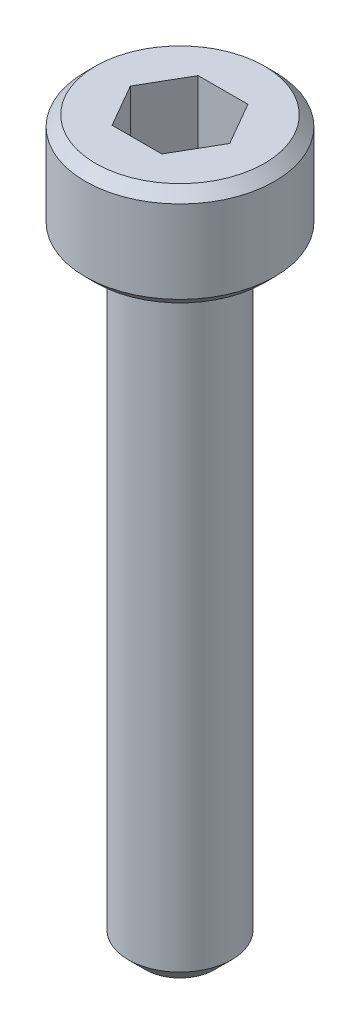
ISO-10303-21;
HEADER;
FILE_DESCRIPTION(('STEP AP214'),'2;1');
FILE_NAME('part.step','',(''),(''),'','','');
FILE_SCHEMA(('AUTOMOTIVE_DESIGN { 1 0 10303 214 1 1 1 1 }'));
ENDSEC;
DATA;
#1=APPLICATION_CONTEXT('core data for automotive mechanical design processes');
#2=APPLICATION_PROTOCOL_DEFINITION('international standard','automotive_design',2000,#1);
#3=PRODUCT_CONTEXT('',#1,'mechanical');
#4=PRODUCT('Part','Part','',(#3));
#5=PRODUCT_RELATED_PRODUCT_CATEGORY('part','',(#4));
#6=PRODUCT_DEFINITION_FORMATION('','',#4);
#7=PRODUCT_DEFINITION_CONTEXT('part definition',#1,'design');
#8=PRODUCT_DEFINITION('design','',#6,#7);
#9=PRODUCT_DEFINITION_SHAPE('','',#8);
#10=(LENGTH_UNIT() NAMED_UNIT(*) SI_UNIT(.MILLI.,.METRE.));
#11=(NAMED_UNIT(*) PLANE_ANGLE_UNIT() SI_UNIT($,.RADIAN.));
#12=(NAMED_UNIT(*) SI_UNIT($,.STERADIAN.) SOLID_ANGLE_UNIT());
#13=UNCERTAINTY_MEASURE_WITH_UNIT(LENGTH_MEASURE(1.E-05),#10,'distance_accuracy_value','');
#14=(GEOMETRIC_REPRESENTATION_CONTEXT(3) GLOBAL_UNCERTAINTY_ASSIGNED_CONTEXT((#13)) GLOBAL_UNIT_ASSIGNED_CONTEXT((#10,
#11,#12)) REPRESENTATION_CONTEXT('',''));
#15=CARTESIAN_POINT('',(0.,0.,0.));
#16=DIRECTION('',(0.,0.,1.));
#17=DIRECTION('',(1.,0.,0.));
#18=AXIS2_PLACEMENT_3D('',#15,#16,#17);
#19=CARTESIAN_POINT('',(-1.44337567297406,0.5,0.));
#20=DIRECTION('',(-0.866025403784439,0.,0.5));
#21=DIRECTION('',(0.5,0.,0.866025403784439));
#22=AXIS2_PLACEMENT_3D('',#19,#20,#21);
#23=PLANE('',#22);
#24=DIRECTION('',(0.,1.,0.));
#25=VECTOR('',#24,1.);
#26=CARTESIAN_POINT('',(-0.721687836487032,0.5,1.25));
#27=LINE('',#26,#25);
#28=CARTESIAN_POINT('',(-0.721687836487032,3.,1.25));
#29=VERTEX_POINT('',#28);
#30=CARTESIAN_POINT('',(-0.721687836487032,0.5,1.25));
#31=VERTEX_POINT('',#30);
#32=EDGE_CURVE('E82',#29,#31,#27,.F.);
#33=ORIENTED_EDGE('',*,*,#32,.T.);
#34=DIRECTION('',(0.5,0.,0.866025403784439));
#35=VECTOR('',#34,1.);
#36=CARTESIAN_POINT('',(-1.44337567297406,0.5,0.));
#37=LINE('',#36,#35);
#38=CARTESIAN_POINT('',(-1.44337567297406,0.5,0.));
#39=VERTEX_POINT('',#38);
#40=EDGE_CURVE('E71',#39,#31,#37,.T.);
#41=ORIENTED_EDGE('',*,*,#40,.F.);
#42=DIRECTION('',(0.,1.,0.));
#43=VECTOR('',#42,1.);
#44=CARTESIAN_POINT('',(-1.44337567297406,0.5,0.));
#45=LINE('',#44,#43);
#46=CARTESIAN_POINT('',(-1.44337567297406,3.,0.));
#47=VERTEX_POINT('',#46);
#48=EDGE_CURVE('E90',#39,#47,#45,.T.);
#49=ORIENTED_EDGE('',*,*,#48,.T.);
#50=DIRECTION('',(0.5,0.,0.866025403784439));
#51=VECTOR('',#50,1.);
#52=CARTESIAN_POINT('',(-1.44337567297406,3.,0.));
#53=LINE('',#52,#51);
#54=EDGE_CURVE('E66',#29,#47,#53,.F.);
#55=ORIENTED_EDGE('',*,*,#54,.F.);
#56=EDGE_LOOP('',(#33,#41,#49,#55));
#57=FACE_BOUND('',#56,.T.);
#58=ADVANCED_FACE('F16',(#57),#23,.F.);
#59=CARTESIAN_POINT('',(-0.721687836487032,0.5,1.25));
#60=DIRECTION('',(0.,0.,1.));
#61=DIRECTION('',(1.,0.,0.));
#62=AXIS2_PLACEMENT_3D('',#59,#60,#61);
#63=PLANE('',#62);
#64=DIRECTION('',(0.,1.,0.));
#65=VECTOR('',#64,1.);
#66=CARTESIAN_POINT('',(0.721687836487032,0.5,1.25));
#67=LINE('',#66,#65);
#68=CARTESIAN_POINT('',(0.721687836487032,3.,1.25));
#69=VERTEX_POINT('',#68);
#70=CARTESIAN_POINT('',(0.721687836487032,0.5,1.25));
#71=VERTEX_POINT('',#70);
#72=EDGE_CURVE('E86',#69,#71,#67,.F.);
#73=ORIENTED_EDGE('',*,*,#72,.T.);
#74=DIRECTION('',(1.,0.,0.));
#75=VECTOR('',#74,1.);
#76=CARTESIAN_POINT('',(-0.721687836487032,0.5,1.25));
#77=LINE('',#76,#75);
#78=EDGE_CURVE('E75',#31,#71,#77,.T.);
#79=ORIENTED_EDGE('',*,*,#78,.F.);
#80=ORIENTED_EDGE('',*,*,#32,.F.);
#81=DIRECTION('',(1.,0.,0.));
#82=VECTOR('',#81,1.);
#83=CARTESIAN_POINT('',(-0.721687836487032,3.,1.25));
#84=LINE('',#83,#82);
#85=EDGE_CURVE('E88',#69,#29,#84,.F.);
#86=ORIENTED_EDGE('',*,*,#85,.F.);
#87=EDGE_LOOP('',(#73,#79,#80,#86));
#88=FACE_BOUND('',#87,.T.);
#89=ADVANCED_FACE('F85',(#88),#63,.F.);
#90=CARTESIAN_POINT('',(-0.721687836487032,0.5,-1.25));
#91=DIRECTION('',(-0.866025403784439,0.,-0.5));
#92=DIRECTION('',(-0.5,0.,0.866025403784439));
#93=AXIS2_PLACEMENT_3D('',#90,#91,#92);
#94=PLANE('',#93);
#95=ORIENTED_EDGE('',*,*,#48,.F.);
#96=DIRECTION('',(-0.5,0.,0.866025403784439));
#97=VECTOR('',#96,1.);
#98=CARTESIAN_POINT('',(-0.721687836487032,0.5,-1.25));
#99=LINE('',#98,#97);
#100=CARTESIAN_POINT('',(-0.721687836487032,0.5,-1.25));
#101=VERTEX_POINT('',#100);
#102=EDGE_CURVE('E78',#101,#39,#99,.T.);
#103=ORIENTED_EDGE('',*,*,#102,.F.);
#104=DIRECTION('',(0.,1.,0.));
#105=VECTOR('',#104,1.);
#106=CARTESIAN_POINT('',(-0.721687836487032,0.5,-1.25));
#107=LINE('',#106,#105);
#108=CARTESIAN_POINT('',(-0.721687836487032,3.,-1.25));
#109=VERTEX_POINT('',#108);
#110=EDGE_CURVE('E123',#101,#109,#107,.T.);
#111=ORIENTED_EDGE('',*,*,#110,.T.);
#112=DIRECTION('',(-0.5,0.,0.866025403784439));
#113=VECTOR('',#112,1.);
#114=CARTESIAN_POINT('',(-0.721687836487032,3.,-1.25));
#115=LINE('',#114,#113);
#116=EDGE_CURVE('E133',#47,#109,#115,.F.);
#117=ORIENTED_EDGE('',*,*,#116,.F.);
#118=EDGE_LOOP('',(#95,#103,#111,#117));
#119=FACE_BOUND('',#118,.T.);
#120=ADVANCED_FACE('F136',(#119),#94,.F.);
#121=CARTESIAN_POINT('',(0.721687836487032,0.5,1.25));
#122=DIRECTION('',(0.866025403784439,0.,0.5));
#123=DIRECTION('',(0.5,0.,-0.866025403784439));
#124=AXIS2_PLACEMENT_3D('',#121,#122,#123);
#125=PLANE('',#124);
#126=DIRECTION('',(0.,1.,0.));
#127=VECTOR('',#126,1.);
#128=CARTESIAN_POINT('',(1.44337567297406,0.5,0.));
#129=LINE('',#128,#127);
#130=CARTESIAN_POINT('',(1.44337567297406,3.,0.));
#131=VERTEX_POINT('',#130);
#132=CARTESIAN_POINT('',(1.44337567297406,0.5,0.));
#133=VERTEX_POINT('',#132);
#134=EDGE_CURVE('E119',#131,#133,#129,.F.);
#135=ORIENTED_EDGE('',*,*,#134,.T.);
#136=DIRECTION('',(0.5,0.,-0.866025403784439));
#137=VECTOR('',#136,1.);
#138=CARTESIAN_POINT('',(0.721687836487032,0.5,1.25));
#139=LINE('',#138,#137);
#140=EDGE_CURVE('E129',#71,#133,#139,.T.);
#141=ORIENTED_EDGE('',*,*,#140,.F.);
#142=ORIENTED_EDGE('',*,*,#72,.F.);
#143=DIRECTION('',(0.5,0.,-0.866025403784439));
#144=VECTOR('',#143,1.);
#145=CARTESIAN_POINT('',(0.721687836487032,3.,1.25));
#146=LINE('',#145,#144);
#147=EDGE_CURVE('E34',#131,#69,#146,.F.);
#148=ORIENTED_EDGE('',*,*,#147,.F.);
#149=EDGE_LOOP('',(#135,#141,#142,#148));
#150=FACE_BOUND('',#149,.T.);
#151=ADVANCED_FACE('F142',(#150),#125,.F.);
#152=CARTESIAN_POINT('',(2.1650635094611,0.5,-1.25));
#153=DIRECTION('',(0.,1.,0.));
#154=DIRECTION('',(0.,0.,1.));
#155=AXIS2_PLACEMENT_3D('',#152,#153,#154);
#156=PLANE('',#155);
#157=ORIENTED_EDGE('',*,*,#40,.T.);
#158=ORIENTED_EDGE('',*,*,#78,.T.);
#159=ORIENTED_EDGE('',*,*,#140,.T.);
#160=DIRECTION('',(-0.5,0.,-0.866025403784439));
#161=VECTOR('',#160,1.);
#162=CARTESIAN_POINT('',(1.44337567297406,0.5,0.));
#163=LINE('',#162,#161);
#164=CARTESIAN_POINT('',(0.721687836487033,0.5,-1.25));
#165=VERTEX_POINT('',#164);
#166=EDGE_CURVE('E117',#133,#165,#163,.T.);
#167=ORIENTED_EDGE('',*,*,#166,.T.);
#168=DIRECTION('',(-1.,0.,0.));
#169=VECTOR('',#168,1.);
#170=CARTESIAN_POINT('',(0.721687836487033,0.5,-1.25));
#171=LINE('',#170,#169);
#172=EDGE_CURVE('E126',#165,#101,#171,.T.);
#173=ORIENTED_EDGE('',*,*,#172,.T.);
#174=ORIENTED_EDGE('',*,*,#102,.T.);
#175=EDGE_LOOP('',(#157,#158,#159,#167,#173,#174));
#176=FACE_BOUND('',#175,.T.);
#177=ADVANCED_FACE('F72',(#176),#156,.T.);
#178=CARTESIAN_POINT('',(0.721687836487033,0.5,-1.25));
#179=DIRECTION('',(0.,0.,-1.));
#180=DIRECTION('',(-1.,0.,0.));
#181=AXIS2_PLACEMENT_3D('',#178,#179,#180);
#182=PLANE('',#181);
#183=ORIENTED_EDGE('',*,*,#110,.F.);
#184=ORIENTED_EDGE('',*,*,#172,.F.);
#185=DIRECTION('',(0.,1.,0.));
#186=VECTOR('',#185,1.);
#187=CARTESIAN_POINT('',(0.721687836487033,0.5,-1.25));
#188=LINE('',#187,#186);
#189=CARTESIAN_POINT('',(0.721687836487033,3.,-1.25));
#190=VERTEX_POINT('',#189);
#191=EDGE_CURVE('E114',#165,#190,#188,.T.);
#192=ORIENTED_EDGE('',*,*,#191,.T.);
#193=DIRECTION('',(-1.,0.,0.));
#194=VECTOR('',#193,1.);
#195=CARTESIAN_POINT('',(0.721687836487033,3.,-1.25));
#196=LINE('',#195,#194);
#197=EDGE_CURVE('E121',#109,#190,#196,.F.);
#198=ORIENTED_EDGE('',*,*,#197,.F.);
#199=EDGE_LOOP('',(#183,#184,#192,#198));
#200=FACE_BOUND('',#199,.T.);
#201=ADVANCED_FACE('F149',(#200),#182,.F.);
#202=CARTESIAN_POINT('',(1.44337567297406,0.5,0.));
#203=DIRECTION('',(0.866025403784439,0.,-0.5));
#204=DIRECTION('',(-0.5,0.,-0.866025403784439));
#205=AXIS2_PLACEMENT_3D('',#202,#203,#204);
#206=PLANE('',#205);
#207=ORIENTED_EDGE('',*,*,#191,.F.);
#208=ORIENTED_EDGE('',*,*,#166,.F.);
#209=ORIENTED_EDGE('',*,*,#134,.F.);
#210=DIRECTION('',(-0.5,0.,-0.866025403784439));
#211=VECTOR('',#210,1.);
#212=CARTESIAN_POINT('',(1.44337567297406,3.,0.));
#213=LINE('',#212,#211);
#214=EDGE_CURVE('E111',#131,#190,#213,.T.);
#215=ORIENTED_EDGE('',*,*,#214,.T.);
#216=EDGE_LOOP('',(#207,#208,#209,#215));
#217=FACE_BOUND('',#216,.T.);
#218=ADVANCED_FACE('F147',(#217),#206,.F.);
#219=CARTESIAN_POINT('',(0.,3.,0.));
#220=DIRECTION('',(0.,-1.,0.));
#221=DIRECTION('',(0.,0.,-1.));
#222=AXIS2_PLACEMENT_3D('',#219,#220,#221);
#223=PLANE('',#222);
#224=CARTESIAN_POINT('',(0.,2.9999999999859,0.));
#225=DIRECTION('',(0.,-1.,0.));
#226=DIRECTION('',(0.,0.,-1.));
#227=AXIS2_PLACEMENT_3D('',#224,#225,#226);
#228=CIRCLE('',#227,2.45000000001028);
#229=CARTESIAN_POINT('',(0.,2.9999999999859,-2.45000000001028));
#230=VERTEX_POINT('',#229);
#231=EDGE_CURVE('E19',#230,#230,#228,.T.);
#232=ORIENTED_EDGE('',*,*,#231,.F.);
#233=EDGE_LOOP('',(#232));
#234=FACE_BOUND('',#233,.T.);
#235=ORIENTED_EDGE('',*,*,#147,.T.);
#236=ORIENTED_EDGE('',*,*,#85,.T.);
#237=ORIENTED_EDGE('',*,*,#54,.T.);
#238=ORIENTED_EDGE('',*,*,#116,.T.);
#239=ORIENTED_EDGE('',*,*,#197,.T.);
#240=ORIENTED_EDGE('',*,*,#214,.F.);
#241=EDGE_LOOP('',(#235,#236,#237,#238,#239,#240));
#242=FACE_BOUND('',#241,.T.);
#243=ADVANCED_FACE('F140',(#234,#242),#223,.F.);
#244=CARTESIAN_POINT('',(0.,2.70000000006121,0.));
#245=DIRECTION('',(0.,-1.,0.));
#246=DIRECTION('',(0.,0.,-1.));
#247=AXIS2_PLACEMENT_3D('',#244,#245,#246);
#248=CONICAL_SURFACE('',#247,2.74999999999181,0.785398163492187);
#249=ORIENTED_EDGE('',*,*,#231,.T.);
#250=EDGE_LOOP('',(#249));
#251=FACE_BOUND('',#250,.T.);
#252=CARTESIAN_POINT('',(0.,2.7,0.));
#253=DIRECTION('',(0.,1.,0.));
#254=DIRECTION('',(0.,0.,1.));
#255=AXIS2_PLACEMENT_3D('',#252,#253,#254);
#256=CIRCLE('',#255,2.75);
#257=CARTESIAN_POINT('',(0.,2.7,2.75));
#258=VERTEX_POINT('',#257);
#259=EDGE_CURVE('E103',#258,#258,#256,.F.);
#260=ORIENTED_EDGE('',*,*,#259,.F.);
#261=EDGE_LOOP('',(#260));
#262=FACE_BOUND('',#261,.T.);
#263=ADVANCED_FACE('F186',(#251,#262),#248,.T.);
#264=CARTESIAN_POINT('',(0.,25.8940533432905,0.));
#265=DIRECTION('',(0.,1.,0.));
#266=DIRECTION('',(0.,0.,1.));
#267=AXIS2_PLACEMENT_3D('',#264,#265,#266);
#268=CYLINDRICAL_SURFACE('',#267,2.75);
#269=CARTESIAN_POINT('',(0.,0.300000000038381,0.));
#270=DIRECTION('',(0.,1.,0.));
#271=DIRECTION('',(0.,0.,1.));
#272=AXIS2_PLACEMENT_3D('',#269,#270,#271);
#273=CIRCLE('',#272,2.74999999999181);
#274=CARTESIAN_POINT('',(0.,0.300000000038381,2.74999999999181));
#275=VERTEX_POINT('',#274);
#276=EDGE_CURVE('E99',#275,#275,#273,.F.);
#277=ORIENTED_EDGE('',*,*,#276,.F.);
#278=EDGE_LOOP('',(#277));
#279=FACE_BOUND('',#278,.T.);
#280=ORIENTED_EDGE('',*,*,#259,.T.);
#281=EDGE_LOOP('',(#280));
#282=FACE_BOUND('',#281,.T.);
#283=ADVANCED_FACE('F182',(#279,#282),#268,.T.);
#284=CARTESIAN_POINT('',(1.50000000000001,-18.,0.));
#285=DIRECTION('',(0.,1.,0.));
#286=DIRECTION('',(0.,0.,1.));
#287=AXIS2_PLACEMENT_3D('',#284,#285,#286);
#288=PLANE('',#287);
#289=CARTESIAN_POINT('',(0.,-18.0000000000291,0.));
#290=DIRECTION('',(0.,1.,0.));
#291=DIRECTION('',(0.,0.,1.));
#292=AXIS2_PLACEMENT_3D('',#289,#290,#291);
#293=CIRCLE('',#292,0.999999999976353);
#294=CARTESIAN_POINT('',(0.,-18.0000000000291,0.999999999976353));
#295=VERTEX_POINT('',#294);
#296=EDGE_CURVE('E97',#295,#295,#293,.T.);
#297=ORIENTED_EDGE('',*,*,#296,.F.);
#298=EDGE_LOOP('',(#297));
#299=FACE_BOUND('',#298,.T.);
#300=ADVANCED_FACE('F178',(#299),#288,.F.);
#301=CARTESIAN_POINT('',(0.,0.299999999924694,0.));
#302=DIRECTION('',(0.,1.,0.));
#303=DIRECTION('',(0.,0.,1.));
#304=AXIS2_PLACEMENT_3D('',#301,#302,#303);
#305=CONICAL_SURFACE('',#304,2.74999999987813,0.785398163302709);
#306=CARTESIAN_POINT('',(0.,5.6843418860808E-11,0.));
#307=DIRECTION('',(0.,1.,0.));
#308=DIRECTION('',(0.,0.,1.));
#309=AXIS2_PLACEMENT_3D('',#306,#307,#308);
#310=CIRCLE('',#309,2.45000000006712);
#311=CARTESIAN_POINT('',(0.,5.6843418860808E-11,2.45000000006712));
#312=VERTEX_POINT('',#311);
#313=EDGE_CURVE('E95',#312,#312,#310,.T.);
#314=ORIENTED_EDGE('',*,*,#313,.T.);
#315=EDGE_LOOP('',(#314));
#316=FACE_BOUND('',#315,.T.);
#317=ORIENTED_EDGE('',*,*,#276,.T.);
#318=EDGE_LOOP('',(#317));
#319=FACE_BOUND('',#318,.T.);
#320=ADVANCED_FACE('F174',(#316,#319),#305,.T.);
#321=CARTESIAN_POINT('',(0.,-17.5000000000978,0.));
#322=DIRECTION('',(0.,1.,0.));
#323=DIRECTION('',(0.,0.,1.));
#324=AXIS2_PLACEMENT_3D('',#321,#322,#323);
#325=CONICAL_SURFACE('',#324,1.49999999990769,0.785398163397448);
#326=CARTESIAN_POINT('',(0.,-17.5,0.));
#327=DIRECTION('',(0.,1.,0.));
#328=DIRECTION('',(0.,0.,1.));
#329=AXIS2_PLACEMENT_3D('',#326,#327,#328);
#330=CIRCLE('',#329,1.5);
#331=CARTESIAN_POINT('',(0.,-17.5,1.5));
#332=VERTEX_POINT('',#331);
#333=EDGE_CURVE('E25',#332,#332,#330,.T.);
#334=ORIENTED_EDGE('',*,*,#333,.F.);
#335=EDGE_LOOP('',(#334));
#336=FACE_BOUND('',#335,.T.);
#337=ORIENTED_EDGE('',*,*,#296,.T.);
#338=EDGE_LOOP('',(#337));
#339=FACE_BOUND('',#338,.T.);
#340=ADVANCED_FACE('F167',(#336,#339),#325,.T.);
#341=CARTESIAN_POINT('',(2.75,0.,0.));
#342=DIRECTION('',(0.,1.,0.));
#343=DIRECTION('',(0.,0.,1.));
#344=AXIS2_PLACEMENT_3D('',#341,#342,#343);
#345=PLANE('',#344);
#346=CARTESIAN_POINT('',(0.,0.,0.));
#347=DIRECTION('',(0.,1.,0.));
#348=DIRECTION('',(0.,0.,1.));
#349=AXIS2_PLACEMENT_3D('',#346,#347,#348);
#350=CIRCLE('',#349,1.5);
#351=CARTESIAN_POINT('',(0.,0.,1.5));
#352=VERTEX_POINT('',#351);
#353=EDGE_CURVE('E11',#352,#352,#350,.F.);
#354=ORIENTED_EDGE('',*,*,#353,.F.);
#355=EDGE_LOOP('',(#354));
#356=FACE_BOUND('',#355,.T.);
#357=ORIENTED_EDGE('',*,*,#313,.F.);
#358=EDGE_LOOP('',(#357));
#359=FACE_BOUND('',#358,.T.);
#360=ADVANCED_FACE('F161',(#356,#359),#345,.F.);
#361=CARTESIAN_POINT('',(0.,25.8940533432905,0.));
#362=DIRECTION('',(0.,1.,0.));
#363=DIRECTION('',(0.,0.,1.));
#364=AXIS2_PLACEMENT_3D('',#361,#362,#363);
#365=CYLINDRICAL_SURFACE('',#364,1.5);
#366=ORIENTED_EDGE('',*,*,#353,.T.);
#367=EDGE_LOOP('',(#366));
#368=FACE_BOUND('',#367,.T.);
#369=ORIENTED_EDGE('',*,*,#333,.T.);
#370=EDGE_LOOP('',(#369));
#371=FACE_BOUND('',#370,.T.);
#372=ADVANCED_FACE('F159',(#368,#371),#365,.T.);
#373=CLOSED_SHELL('',(#58,#89,#120,#151,#177,#201,#218,#243,#263,#283,#300,#320,#340,#360,#372));
#374=MANIFOLD_SOLID_BREP('B1',#373);
#375=ADVANCED_BREP_SHAPE_REPRESENTATION('',(#18,#374),#14);
#376=SHAPE_DEFINITION_REPRESENTATION(#9,#375);
ENDSEC;
END-ISO-10303-21;
